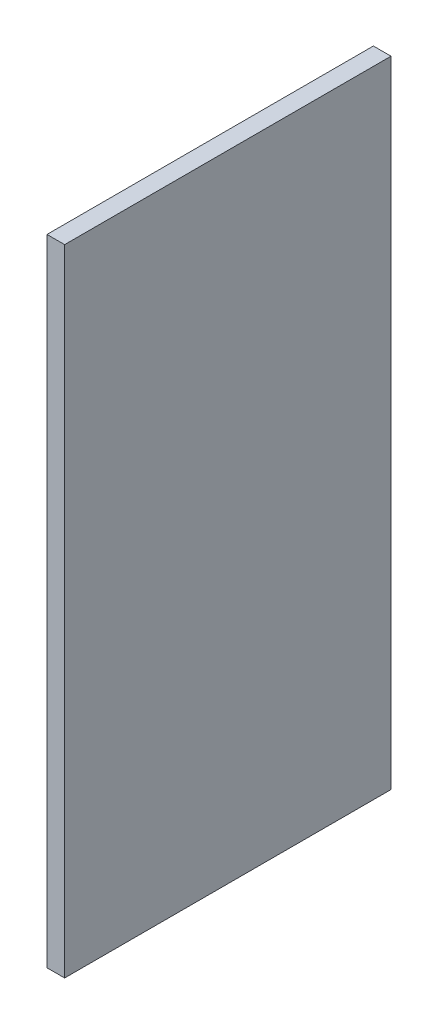
ISO-10303-21;
HEADER;
FILE_DESCRIPTION(('STEP AP214'),'2;1');
FILE_NAME('part.step','',(''),(''),'','','');
FILE_SCHEMA(('AUTOMOTIVE_DESIGN { 1 0 10303 214 1 1 1 1 }'));
ENDSEC;
DATA;
#1=APPLICATION_CONTEXT('core data for automotive mechanical design processes');
#2=APPLICATION_PROTOCOL_DEFINITION('international standard','automotive_design',2000,#1);
#3=PRODUCT_CONTEXT('',#1,'mechanical');
#4=PRODUCT('Part','Part','',(#3));
#5=PRODUCT_RELATED_PRODUCT_CATEGORY('part','',(#4));
#6=PRODUCT_DEFINITION_FORMATION('','',#4);
#7=PRODUCT_DEFINITION_CONTEXT('part definition',#1,'design');
#8=PRODUCT_DEFINITION('design','',#6,#7);
#9=PRODUCT_DEFINITION_SHAPE('','',#8);
#10=(LENGTH_UNIT() NAMED_UNIT(*) SI_UNIT(.MILLI.,.METRE.));
#11=(NAMED_UNIT(*) PLANE_ANGLE_UNIT() SI_UNIT($,.RADIAN.));
#12=(NAMED_UNIT(*) SI_UNIT($,.STERADIAN.) SOLID_ANGLE_UNIT());
#13=UNCERTAINTY_MEASURE_WITH_UNIT(LENGTH_MEASURE(1.E-05),#10,'distance_accuracy_value','');
#14=(GEOMETRIC_REPRESENTATION_CONTEXT(3) GLOBAL_UNCERTAINTY_ASSIGNED_CONTEXT((#13)) GLOBAL_UNIT_ASSIGNED_CONTEXT((#10,
#11,#12)) REPRESENTATION_CONTEXT('',''));
#15=CARTESIAN_POINT('',(0.,0.,0.));
#16=DIRECTION('',(0.,0.,1.));
#17=DIRECTION('',(1.,0.,0.));
#18=AXIS2_PLACEMENT_3D('',#15,#16,#17);
#19=CARTESIAN_POINT('',(304.8,482.6,-107.95));
#20=DIRECTION('',(-1.,0.,0.));
#21=DIRECTION('',(0.,0.,1.));
#22=AXIS2_PLACEMENT_3D('',#19,#20,#21);
#23=PLANE('',#22);
#24=DIRECTION('',(0.,0.,-1.));
#25=VECTOR('',#24,1.);
#26=CARTESIAN_POINT('',(304.8,25.3999999999999,-107.95));
#27=LINE('',#26,#25);
#28=CARTESIAN_POINT('',(304.8,25.3999999999999,127.));
#29=VERTEX_POINT('',#28);
#30=CARTESIAN_POINT('',(304.8,25.3999999999999,-107.95));
#31=VERTEX_POINT('',#30);
#32=EDGE_CURVE('E98',#29,#31,#27,.T.);
#33=ORIENTED_EDGE('',*,*,#32,.T.);
#34=DIRECTION('',(0.,-1.,0.));
#35=VECTOR('',#34,1.);
#36=CARTESIAN_POINT('',(304.8,482.6,-107.95));
#37=LINE('',#36,#35);
#38=CARTESIAN_POINT('',(304.8,482.6,-107.95));
#39=VERTEX_POINT('',#38);
#40=EDGE_CURVE('E11',#39,#31,#37,.T.);
#41=ORIENTED_EDGE('',*,*,#40,.F.);
#42=DIRECTION('',(0.,0.,-1.));
#43=VECTOR('',#42,1.);
#44=CARTESIAN_POINT('',(304.8,482.6,-107.95));
#45=LINE('',#44,#43);
#46=CARTESIAN_POINT('',(304.8,482.6,127.));
#47=VERTEX_POINT('',#46);
#48=EDGE_CURVE('E86',#47,#39,#45,.T.);
#49=ORIENTED_EDGE('',*,*,#48,.F.);
#50=DIRECTION('',(0.,-1.,0.));
#51=VECTOR('',#50,1.);
#52=CARTESIAN_POINT('',(304.8,482.6,127.));
#53=LINE('',#52,#51);
#54=EDGE_CURVE('E94',#47,#29,#53,.T.);
#55=ORIENTED_EDGE('',*,*,#54,.T.);
#56=EDGE_LOOP('',(#33,#41,#49,#55));
#57=FACE_BOUND('',#56,.T.);
#58=ADVANCED_FACE('F35',(#57),#23,.F.);
#59=CARTESIAN_POINT('',(304.8,482.6,-107.95));
#60=DIRECTION('',(0.,0.,1.));
#61=DIRECTION('',(1.,0.,0.));
#62=AXIS2_PLACEMENT_3D('',#59,#60,#61);
#63=PLANE('',#62);
#64=DIRECTION('',(-1.,0.,0.));
#65=VECTOR('',#64,1.);
#66=CARTESIAN_POINT('',(304.8,25.3999999999999,-107.95));
#67=LINE('',#66,#65);
#68=CARTESIAN_POINT('',(292.1,25.3999999999999,-107.95));
#69=VERTEX_POINT('',#68);
#70=EDGE_CURVE('E90',#31,#69,#67,.T.);
#71=ORIENTED_EDGE('',*,*,#70,.T.);
#72=DIRECTION('',(0.,-1.,0.));
#73=VECTOR('',#72,1.);
#74=CARTESIAN_POINT('',(292.1,482.6,-107.95));
#75=LINE('',#74,#73);
#76=CARTESIAN_POINT('',(292.1,482.6,-107.95));
#77=VERTEX_POINT('',#76);
#78=EDGE_CURVE('E43',#77,#69,#75,.T.);
#79=ORIENTED_EDGE('',*,*,#78,.F.);
#80=DIRECTION('',(-1.,0.,0.));
#81=VECTOR('',#80,1.);
#82=CARTESIAN_POINT('',(304.8,482.6,-107.95));
#83=LINE('',#82,#81);
#84=EDGE_CURVE('E81',#39,#77,#83,.T.);
#85=ORIENTED_EDGE('',*,*,#84,.F.);
#86=ORIENTED_EDGE('',*,*,#40,.T.);
#87=EDGE_LOOP('',(#71,#79,#85,#86));
#88=FACE_BOUND('',#87,.T.);
#89=ADVANCED_FACE('F89',(#88),#63,.F.);
#90=CARTESIAN_POINT('',(292.1,482.6,-107.95));
#91=DIRECTION('',(1.,0.,0.));
#92=DIRECTION('',(0.,0.,-1.));
#93=AXIS2_PLACEMENT_3D('',#90,#91,#92);
#94=PLANE('',#93);
#95=DIRECTION('',(0.,0.,1.));
#96=VECTOR('',#95,1.);
#97=CARTESIAN_POINT('',(292.1,25.3999999999999,-107.95));
#98=LINE('',#97,#96);
#99=CARTESIAN_POINT('',(292.1,25.3999999999999,127.));
#100=VERTEX_POINT('',#99);
#101=EDGE_CURVE('E68',#69,#100,#98,.T.);
#102=ORIENTED_EDGE('',*,*,#101,.T.);
#103=DIRECTION('',(0.,-1.,0.));
#104=VECTOR('',#103,1.);
#105=CARTESIAN_POINT('',(292.1,482.6,127.));
#106=LINE('',#105,#104);
#107=CARTESIAN_POINT('',(292.1,482.6,127.));
#108=VERTEX_POINT('',#107);
#109=EDGE_CURVE('E91',#108,#100,#106,.T.);
#110=ORIENTED_EDGE('',*,*,#109,.F.);
#111=DIRECTION('',(0.,0.,1.));
#112=VECTOR('',#111,1.);
#113=CARTESIAN_POINT('',(292.1,482.6,-107.95));
#114=LINE('',#113,#112);
#115=EDGE_CURVE('E84',#77,#108,#114,.T.);
#116=ORIENTED_EDGE('',*,*,#115,.F.);
#117=ORIENTED_EDGE('',*,*,#78,.T.);
#118=EDGE_LOOP('',(#102,#110,#116,#117));
#119=FACE_BOUND('',#118,.T.);
#120=ADVANCED_FACE('F92',(#119),#94,.F.);
#121=CARTESIAN_POINT('',(304.8,482.6,127.));
#122=DIRECTION('',(0.,0.,-1.));
#123=DIRECTION('',(-1.,0.,0.));
#124=AXIS2_PLACEMENT_3D('',#121,#122,#123);
#125=PLANE('',#124);
#126=DIRECTION('',(1.,0.,0.));
#127=VECTOR('',#126,1.);
#128=CARTESIAN_POINT('',(304.8,25.3999999999999,127.));
#129=LINE('',#128,#127);
#130=EDGE_CURVE('E74',#100,#29,#129,.T.);
#131=ORIENTED_EDGE('',*,*,#130,.T.);
#132=ORIENTED_EDGE('',*,*,#54,.F.);
#133=DIRECTION('',(1.,0.,0.));
#134=VECTOR('',#133,1.);
#135=CARTESIAN_POINT('',(304.8,482.6,127.));
#136=LINE('',#135,#134);
#137=EDGE_CURVE('E51',#108,#47,#136,.T.);
#138=ORIENTED_EDGE('',*,*,#137,.F.);
#139=ORIENTED_EDGE('',*,*,#109,.T.);
#140=EDGE_LOOP('',(#131,#132,#138,#139));
#141=FACE_BOUND('',#140,.T.);
#142=ADVANCED_FACE('F105',(#141),#125,.F.);
#143=CARTESIAN_POINT('',(0.,482.6,0.));
#144=DIRECTION('',(0.,-1.,0.));
#145=DIRECTION('',(0.,0.,-1.));
#146=AXIS2_PLACEMENT_3D('',#143,#144,#145);
#147=PLANE('',#146);
#148=ORIENTED_EDGE('',*,*,#48,.T.);
#149=ORIENTED_EDGE('',*,*,#84,.T.);
#150=ORIENTED_EDGE('',*,*,#115,.T.);
#151=ORIENTED_EDGE('',*,*,#137,.T.);
#152=EDGE_LOOP('',(#148,#149,#150,#151));
#153=FACE_BOUND('',#152,.T.);
#154=ADVANCED_FACE('F82',(#153),#147,.F.);
#155=CARTESIAN_POINT('',(0.,25.3999999999999,0.));
#156=DIRECTION('',(0.,-1.,0.));
#157=DIRECTION('',(0.,0.,-1.));
#158=AXIS2_PLACEMENT_3D('',#155,#156,#157);
#159=PLANE('',#158);
#160=ORIENTED_EDGE('',*,*,#32,.F.);
#161=ORIENTED_EDGE('',*,*,#130,.F.);
#162=ORIENTED_EDGE('',*,*,#101,.F.);
#163=ORIENTED_EDGE('',*,*,#70,.F.);
#164=EDGE_LOOP('',(#160,#161,#162,#163));
#165=FACE_BOUND('',#164,.T.);
#166=ADVANCED_FACE('F108',(#165),#159,.T.);
#167=CLOSED_SHELL('',(#58,#89,#120,#142,#154,#166));
#168=MANIFOLD_SOLID_BREP('B2',#167);
#169=ADVANCED_BREP_SHAPE_REPRESENTATION('',(#18,#168),#14);
#170=SHAPE_DEFINITION_REPRESENTATION(#9,#169);
ENDSEC;
END-ISO-10303-21;
